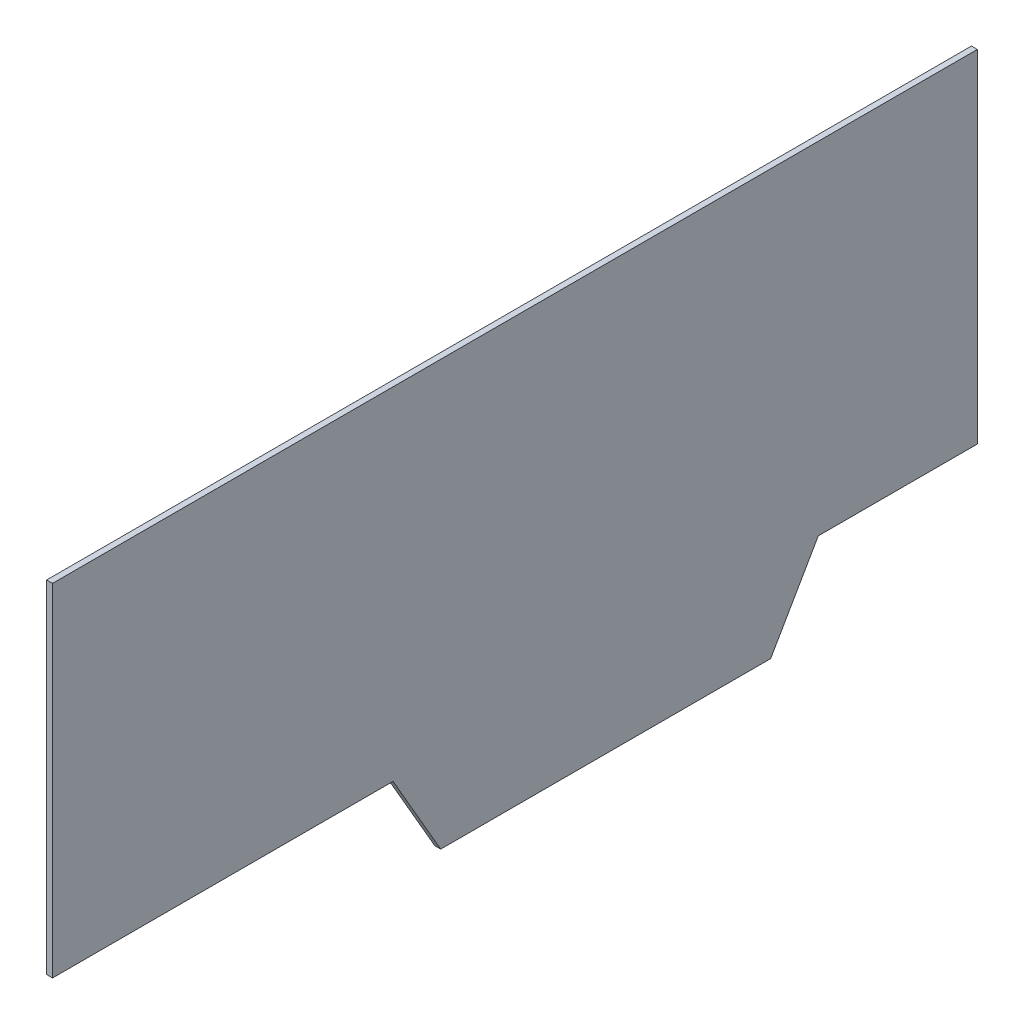
ISO-10303-21;
HEADER;
FILE_DESCRIPTION(('STEP AP214'),'2;1');
FILE_NAME('part.step','',(''),(''),'','','');
FILE_SCHEMA(('AUTOMOTIVE_DESIGN { 1 0 10303 214 1 1 1 1 }'));
ENDSEC;
DATA;
#1=APPLICATION_CONTEXT('core data for automotive mechanical design processes');
#2=APPLICATION_PROTOCOL_DEFINITION('international standard','automotive_design',2000,#1);
#3=PRODUCT_CONTEXT('',#1,'mechanical');
#4=PRODUCT('Part','Part','',(#3));
#5=PRODUCT_RELATED_PRODUCT_CATEGORY('part','',(#4));
#6=PRODUCT_DEFINITION_FORMATION('','',#4);
#7=PRODUCT_DEFINITION_CONTEXT('part definition',#1,'design');
#8=PRODUCT_DEFINITION('design','',#6,#7);
#9=PRODUCT_DEFINITION_SHAPE('','',#8);
#10=(LENGTH_UNIT() NAMED_UNIT(*) SI_UNIT(.MILLI.,.METRE.));
#11=(NAMED_UNIT(*) PLANE_ANGLE_UNIT() SI_UNIT($,.RADIAN.));
#12=(NAMED_UNIT(*) SI_UNIT($,.STERADIAN.) SOLID_ANGLE_UNIT());
#13=UNCERTAINTY_MEASURE_WITH_UNIT(LENGTH_MEASURE(1.E-05),#10,'distance_accuracy_value','');
#14=(GEOMETRIC_REPRESENTATION_CONTEXT(3) GLOBAL_UNCERTAINTY_ASSIGNED_CONTEXT((#13)) GLOBAL_UNIT_ASSIGNED_CONTEXT((#10,
#11,#12)) REPRESENTATION_CONTEXT('',''));
#15=CARTESIAN_POINT('',(0.,0.,0.));
#16=DIRECTION('',(0.,0.,1.));
#17=DIRECTION('',(1.,0.,0.));
#18=AXIS2_PLACEMENT_3D('',#15,#16,#17);
#19=CARTESIAN_POINT('',(1.5875,88.9,-249.174));
#20=DIRECTION('',(0.,0.,1.));
#21=DIRECTION('',(0.,-1.,0.));
#22=AXIS2_PLACEMENT_3D('',#19,#20,#21);
#23=PLANE('',#22);
#24=DIRECTION('',(0.,1.,0.));
#25=VECTOR('',#24,1.);
#26=CARTESIAN_POINT('',(-1.5875,88.9,-249.174));
#27=LINE('',#26,#25);
#28=CARTESIAN_POINT('',(-1.5875,-95.25,-249.174));
#29=VERTEX_POINT('',#28);
#30=CARTESIAN_POINT('',(-1.5875,88.9,-249.174));
#31=VERTEX_POINT('',#30);
#32=EDGE_CURVE('E116',#29,#31,#27,.T.);
#33=ORIENTED_EDGE('',*,*,#32,.T.);
#34=DIRECTION('',(-1.,0.,0.));
#35=VECTOR('',#34,1.);
#36=CARTESIAN_POINT('',(1.5875,88.9,-249.174));
#37=LINE('',#36,#35);
#38=CARTESIAN_POINT('',(1.5875,88.9,-249.174));
#39=VERTEX_POINT('',#38);
#40=EDGE_CURVE('E11',#39,#31,#37,.T.);
#41=ORIENTED_EDGE('',*,*,#40,.F.);
#42=DIRECTION('',(0.,1.,0.));
#43=VECTOR('',#42,1.);
#44=CARTESIAN_POINT('',(1.5875,88.9,-249.174));
#45=LINE('',#44,#43);
#46=CARTESIAN_POINT('',(1.5875,-95.25,-249.174));
#47=VERTEX_POINT('',#46);
#48=EDGE_CURVE('E159',#47,#39,#45,.T.);
#49=ORIENTED_EDGE('',*,*,#48,.F.);
#50=DIRECTION('',(1.,0.,0.));
#51=VECTOR('',#50,1.);
#52=CARTESIAN_POINT('',(-1.5875,-95.25,-249.174));
#53=LINE('',#52,#51);
#54=EDGE_CURVE('E128',#29,#47,#53,.T.);
#55=ORIENTED_EDGE('',*,*,#54,.F.);
#56=EDGE_LOOP('',(#33,#41,#49,#55));
#57=FACE_BOUND('',#56,.T.);
#58=ADVANCED_FACE('F35',(#57),#23,.F.);
#59=CARTESIAN_POINT('',(1.5875,88.9,249.174));
#60=DIRECTION('',(0.,-1.,0.));
#61=DIRECTION('',(0.,0.,-1.));
#62=AXIS2_PLACEMENT_3D('',#59,#60,#61);
#63=PLANE('',#62);
#64=DIRECTION('',(0.,0.,1.));
#65=VECTOR('',#64,1.);
#66=CARTESIAN_POINT('',(-1.5875,88.9,249.174));
#67=LINE('',#66,#65);
#68=CARTESIAN_POINT('',(-1.5875,88.9,249.174));
#69=VERTEX_POINT('',#68);
#70=EDGE_CURVE('E62',#31,#69,#67,.T.);
#71=ORIENTED_EDGE('',*,*,#70,.T.);
#72=DIRECTION('',(-1.,0.,0.));
#73=VECTOR('',#72,1.);
#74=CARTESIAN_POINT('',(1.5875,88.9,249.174));
#75=LINE('',#74,#73);
#76=CARTESIAN_POINT('',(1.5875,88.9,249.174));
#77=VERTEX_POINT('',#76);
#78=EDGE_CURVE('E43',#77,#69,#75,.T.);
#79=ORIENTED_EDGE('',*,*,#78,.F.);
#80=DIRECTION('',(0.,0.,1.));
#81=VECTOR('',#80,1.);
#82=CARTESIAN_POINT('',(1.5875,88.9,249.174));
#83=LINE('',#82,#81);
#84=EDGE_CURVE('E51',#39,#77,#83,.T.);
#85=ORIENTED_EDGE('',*,*,#84,.F.);
#86=ORIENTED_EDGE('',*,*,#40,.T.);
#87=EDGE_LOOP('',(#71,#79,#85,#86));
#88=FACE_BOUND('',#87,.T.);
#89=ADVANCED_FACE('F190',(#88),#63,.F.);
#90=CARTESIAN_POINT('',(1.5875,88.9,249.174));
#91=DIRECTION('',(0.,0.,-1.));
#92=DIRECTION('',(-1.,0.,0.));
#93=AXIS2_PLACEMENT_3D('',#90,#91,#92);
#94=PLANE('',#93);
#95=DIRECTION('',(0.,-1.,0.));
#96=VECTOR('',#95,1.);
#97=CARTESIAN_POINT('',(-1.5875,88.9,249.174));
#98=LINE('',#97,#96);
#99=CARTESIAN_POINT('',(-1.5875,-95.25,249.174));
#100=VERTEX_POINT('',#99);
#101=EDGE_CURVE('E69',#69,#100,#98,.T.);
#102=ORIENTED_EDGE('',*,*,#101,.T.);
#103=DIRECTION('',(1.,0.,0.));
#104=VECTOR('',#103,1.);
#105=CARTESIAN_POINT('',(-1.5875,-95.25,249.174));
#106=LINE('',#105,#104);
#107=CARTESIAN_POINT('',(1.5875,-95.25,249.174));
#108=VERTEX_POINT('',#107);
#109=EDGE_CURVE('E152',#100,#108,#106,.T.);
#110=ORIENTED_EDGE('',*,*,#109,.T.);
#111=DIRECTION('',(0.,-1.,0.));
#112=VECTOR('',#111,1.);
#113=CARTESIAN_POINT('',(1.5875,88.9,249.174));
#114=LINE('',#113,#112);
#115=EDGE_CURVE('E93',#77,#108,#114,.T.);
#116=ORIENTED_EDGE('',*,*,#115,.F.);
#117=ORIENTED_EDGE('',*,*,#78,.T.);
#118=EDGE_LOOP('',(#102,#110,#116,#117));
#119=FACE_BOUND('',#118,.T.);
#120=ADVANCED_FACE('F165',(#119),#94,.F.);
#121=CARTESIAN_POINT('',(1.5875,0.,0.));
#122=DIRECTION('',(1.,0.,0.));
#123=DIRECTION('',(0.,0.,-1.));
#124=AXIS2_PLACEMENT_3D('',#121,#122,#123);
#125=PLANE('',#124);
#126=ORIENTED_EDGE('',*,*,#48,.T.);
#127=ORIENTED_EDGE('',*,*,#84,.T.);
#128=ORIENTED_EDGE('',*,*,#115,.T.);
#129=DIRECTION('',(0.,0.,-1.));
#130=VECTOR('',#129,1.);
#131=CARTESIAN_POINT('',(1.5875,-95.25,0.));
#132=LINE('',#131,#130);
#133=CARTESIAN_POINT('',(1.5875,-95.25,65.6774389309574));
#134=VERTEX_POINT('',#133);
#135=EDGE_CURVE('E140',#108,#134,#132,.T.);
#136=ORIENTED_EDGE('',*,*,#135,.T.);
#137=DIRECTION('',(0.,-0.86602540378444,-0.499999999999998));
#138=VECTOR('',#137,1.);
#139=CARTESIAN_POINT('',(1.5875,-52.2516652848548,90.502539053452));
#140=LINE('',#139,#138);
#141=CARTESIAN_POINT('',(1.5875,-139.7,40.0142194654786));
#142=VERTEX_POINT('',#141);
#143=EDGE_CURVE('E142',#134,#142,#140,.T.);
#144=ORIENTED_EDGE('',*,*,#143,.T.);
#145=DIRECTION('',(0.,0.,1.));
#146=VECTOR('',#145,1.);
#147=CARTESIAN_POINT('',(1.5875,-139.7,0.));
#148=LINE('',#147,#146);
#149=CARTESIAN_POINT('',(1.5875,-139.7,-137.785780534521));
#150=VERTEX_POINT('',#149);
#151=EDGE_CURVE('E145',#150,#142,#148,.T.);
#152=ORIENTED_EDGE('',*,*,#151,.F.);
#153=DIRECTION('',(0.,-0.86602540378444,0.499999999999998));
#154=VECTOR('',#153,1.);
#155=CARTESIAN_POINT('',(1.5875,-94.587993111581,-163.831209855234));
#156=LINE('',#155,#154);
#157=CARTESIAN_POINT('',(1.5875,-95.25,-163.449));
#158=VERTEX_POINT('',#157);
#159=EDGE_CURVE('E148',#158,#150,#156,.T.);
#160=ORIENTED_EDGE('',*,*,#159,.F.);
#161=DIRECTION('',(0.,0.,1.));
#162=VECTOR('',#161,1.);
#163=CARTESIAN_POINT('',(1.5875,-95.2500000000001,0.));
#164=LINE('',#163,#162);
#165=EDGE_CURVE('E125',#47,#158,#164,.T.);
#166=ORIENTED_EDGE('',*,*,#165,.F.);
#167=EDGE_LOOP('',(#126,#127,#128,#136,#144,#152,#160,#166));
#168=FACE_BOUND('',#167,.T.);
#169=ADVANCED_FACE('F176',(#168),#125,.T.);
#170=CARTESIAN_POINT('',(-1.5875,0.,0.));
#171=DIRECTION('',(1.,0.,0.));
#172=DIRECTION('',(0.,0.,-1.));
#173=AXIS2_PLACEMENT_3D('',#170,#171,#172);
#174=PLANE('',#173);
#175=ORIENTED_EDGE('',*,*,#32,.F.);
#176=DIRECTION('',(0.,0.,1.));
#177=VECTOR('',#176,1.);
#178=CARTESIAN_POINT('',(-1.5875,-95.2500000000001,0.));
#179=LINE('',#178,#177);
#180=CARTESIAN_POINT('',(-1.5875,-95.25,-163.449));
#181=VERTEX_POINT('',#180);
#182=EDGE_CURVE('E109',#29,#181,#179,.T.);
#183=ORIENTED_EDGE('',*,*,#182,.T.);
#184=DIRECTION('',(0.,-0.86602540378444,0.499999999999998));
#185=VECTOR('',#184,1.);
#186=CARTESIAN_POINT('',(-1.5875,-94.587993111581,-163.831209855234));
#187=LINE('',#186,#185);
#188=CARTESIAN_POINT('',(-1.5875,-139.7,-137.785780534521));
#189=VERTEX_POINT('',#188);
#190=EDGE_CURVE('E113',#181,#189,#187,.T.);
#191=ORIENTED_EDGE('',*,*,#190,.T.);
#192=DIRECTION('',(0.,0.,1.));
#193=VECTOR('',#192,1.);
#194=CARTESIAN_POINT('',(-1.5875,-139.7,0.));
#195=LINE('',#194,#193);
#196=CARTESIAN_POINT('',(-1.5875,-139.7,40.0142194654786));
#197=VERTEX_POINT('',#196);
#198=EDGE_CURVE('E134',#189,#197,#195,.T.);
#199=ORIENTED_EDGE('',*,*,#198,.T.);
#200=DIRECTION('',(0.,-0.86602540378444,-0.499999999999998));
#201=VECTOR('',#200,1.);
#202=CARTESIAN_POINT('',(-1.5875,-52.2516652848548,90.502539053452));
#203=LINE('',#202,#201);
#204=CARTESIAN_POINT('',(-1.5875,-95.25,65.6774389309574));
#205=VERTEX_POINT('',#204);
#206=EDGE_CURVE('E136',#205,#197,#203,.T.);
#207=ORIENTED_EDGE('',*,*,#206,.F.);
#208=DIRECTION('',(0.,0.,-1.));
#209=VECTOR('',#208,1.);
#210=CARTESIAN_POINT('',(-1.5875,-95.25,0.));
#211=LINE('',#210,#209);
#212=EDGE_CURVE('E151',#100,#205,#211,.T.);
#213=ORIENTED_EDGE('',*,*,#212,.F.);
#214=ORIENTED_EDGE('',*,*,#101,.F.);
#215=ORIENTED_EDGE('',*,*,#70,.F.);
#216=EDGE_LOOP('',(#175,#183,#191,#199,#207,#213,#214,#215));
#217=FACE_BOUND('',#216,.T.);
#218=ADVANCED_FACE('F111',(#217),#174,.F.);
#219=CARTESIAN_POINT('',(-1.5875,-95.25,0.));
#220=DIRECTION('',(0.,-1.,0.));
#221=DIRECTION('',(0.,0.,-1.));
#222=AXIS2_PLACEMENT_3D('',#219,#220,#221);
#223=PLANE('',#222);
#224=ORIENTED_EDGE('',*,*,#135,.F.);
#225=ORIENTED_EDGE('',*,*,#109,.F.);
#226=ORIENTED_EDGE('',*,*,#212,.T.);
#227=DIRECTION('',(1.,0.,0.));
#228=VECTOR('',#227,1.);
#229=CARTESIAN_POINT('',(-1.5875,-95.25,65.6774389309574));
#230=LINE('',#229,#228);
#231=EDGE_CURVE('E100',#205,#134,#230,.T.);
#232=ORIENTED_EDGE('',*,*,#231,.T.);
#233=EDGE_LOOP('',(#224,#225,#226,#232));
#234=FACE_BOUND('',#233,.T.);
#235=ADVANCED_FACE('F178',(#234),#223,.T.);
#236=CARTESIAN_POINT('',(-1.5875,-95.2500000000001,0.));
#237=DIRECTION('',(0.,1.,0.));
#238=DIRECTION('',(0.,0.,1.));
#239=AXIS2_PLACEMENT_3D('',#236,#237,#238);
#240=PLANE('',#239);
#241=ORIENTED_EDGE('',*,*,#165,.T.);
#242=DIRECTION('',(1.,0.,0.));
#243=VECTOR('',#242,1.);
#244=CARTESIAN_POINT('',(-1.5875,-95.25,-163.449));
#245=LINE('',#244,#243);
#246=EDGE_CURVE('E122',#181,#158,#245,.T.);
#247=ORIENTED_EDGE('',*,*,#246,.F.);
#248=ORIENTED_EDGE('',*,*,#182,.F.);
#249=ORIENTED_EDGE('',*,*,#54,.T.);
#250=EDGE_LOOP('',(#241,#247,#248,#249));
#251=FACE_BOUND('',#250,.T.);
#252=ADVANCED_FACE('F123',(#251),#240,.F.);
#253=CARTESIAN_POINT('',(-1.5875,-94.587993111581,-163.831209855234));
#254=DIRECTION('',(0.,0.499999999999998,0.86602540378444));
#255=DIRECTION('',(0.,-0.86602540378444,0.499999999999998));
#256=AXIS2_PLACEMENT_3D('',#253,#254,#255);
#257=PLANE('',#256);
#258=ORIENTED_EDGE('',*,*,#159,.T.);
#259=DIRECTION('',(1.,0.,0.));
#260=VECTOR('',#259,1.);
#261=CARTESIAN_POINT('',(-1.5875,-139.7,-137.785780534521));
#262=LINE('',#261,#260);
#263=EDGE_CURVE('E129',#189,#150,#262,.T.);
#264=ORIENTED_EDGE('',*,*,#263,.F.);
#265=ORIENTED_EDGE('',*,*,#190,.F.);
#266=ORIENTED_EDGE('',*,*,#246,.T.);
#267=EDGE_LOOP('',(#258,#264,#265,#266));
#268=FACE_BOUND('',#267,.T.);
#269=ADVANCED_FACE('F131',(#268),#257,.F.);
#270=CARTESIAN_POINT('',(-1.5875,-139.7,0.));
#271=DIRECTION('',(0.,1.,0.));
#272=DIRECTION('',(0.,0.,1.));
#273=AXIS2_PLACEMENT_3D('',#270,#271,#272);
#274=PLANE('',#273);
#275=ORIENTED_EDGE('',*,*,#151,.T.);
#276=DIRECTION('',(1.,0.,0.));
#277=VECTOR('',#276,1.);
#278=CARTESIAN_POINT('',(-1.5875,-139.7,40.0142194654786));
#279=LINE('',#278,#277);
#280=EDGE_CURVE('E156',#197,#142,#279,.T.);
#281=ORIENTED_EDGE('',*,*,#280,.F.);
#282=ORIENTED_EDGE('',*,*,#198,.F.);
#283=ORIENTED_EDGE('',*,*,#263,.T.);
#284=EDGE_LOOP('',(#275,#281,#282,#283));
#285=FACE_BOUND('',#284,.T.);
#286=ADVANCED_FACE('F175',(#285),#274,.F.);
#287=CARTESIAN_POINT('',(-1.5875,-52.2516652848548,90.502539053452));
#288=DIRECTION('',(0.,-0.499999999999998,0.86602540378444));
#289=DIRECTION('',(0.,-0.86602540378444,-0.499999999999998));
#290=AXIS2_PLACEMENT_3D('',#287,#288,#289);
#291=PLANE('',#290);
#292=ORIENTED_EDGE('',*,*,#143,.F.);
#293=ORIENTED_EDGE('',*,*,#231,.F.);
#294=ORIENTED_EDGE('',*,*,#206,.T.);
#295=ORIENTED_EDGE('',*,*,#280,.T.);
#296=EDGE_LOOP('',(#292,#293,#294,#295));
#297=FACE_BOUND('',#296,.T.);
#298=ADVANCED_FACE('F171',(#297),#291,.T.);
#299=CLOSED_SHELL('',(#58,#89,#120,#169,#218,#235,#252,#269,#286,#298));
#300=MANIFOLD_SOLID_BREP('B2',#299);
#301=ADVANCED_BREP_SHAPE_REPRESENTATION('',(#18,#300),#14);
#302=SHAPE_DEFINITION_REPRESENTATION(#9,#301);
ENDSEC;
END-ISO-10303-21;
